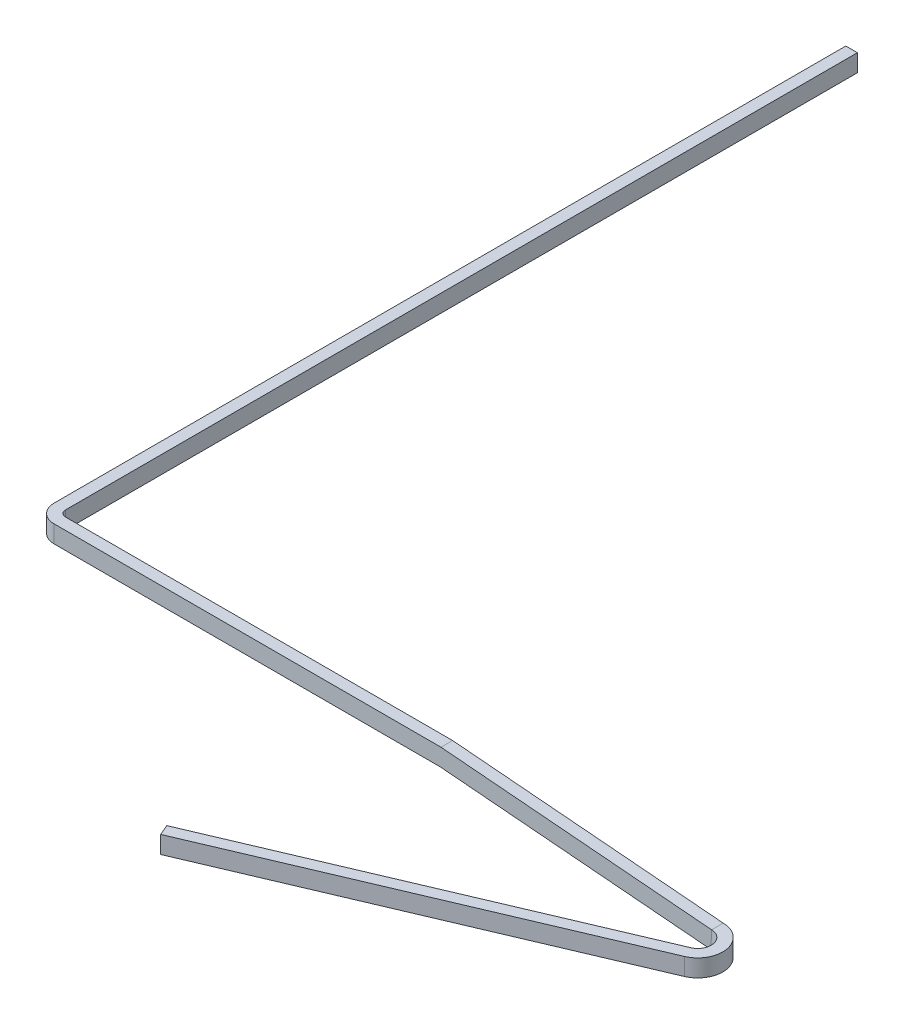
ISO-10303-21;
HEADER;
FILE_DESCRIPTION(('STEP AP214'),'2;1');
FILE_NAME('part.step','',(''),(''),'','','');
FILE_SCHEMA(('AUTOMOTIVE_DESIGN { 1 0 10303 214 1 1 1 1 }'));
ENDSEC;
DATA;
#1=APPLICATION_CONTEXT('core data for automotive mechanical design processes');
#2=APPLICATION_PROTOCOL_DEFINITION('international standard','automotive_design',2000,#1);
#3=PRODUCT_CONTEXT('',#1,'mechanical');
#4=PRODUCT('Part','Part','',(#3));
#5=PRODUCT_RELATED_PRODUCT_CATEGORY('part','',(#4));
#6=PRODUCT_DEFINITION_FORMATION('','',#4);
#7=PRODUCT_DEFINITION_CONTEXT('part definition',#1,'design');
#8=PRODUCT_DEFINITION('design','',#6,#7);
#9=PRODUCT_DEFINITION_SHAPE('','',#8);
#10=(LENGTH_UNIT() NAMED_UNIT(*) SI_UNIT(.MILLI.,.METRE.));
#11=(NAMED_UNIT(*) PLANE_ANGLE_UNIT() SI_UNIT($,.RADIAN.));
#12=(NAMED_UNIT(*) SI_UNIT($,.STERADIAN.) SOLID_ANGLE_UNIT());
#13=UNCERTAINTY_MEASURE_WITH_UNIT(LENGTH_MEASURE(1.E-05),#10,'distance_accuracy_value','');
#14=(GEOMETRIC_REPRESENTATION_CONTEXT(3) GLOBAL_UNCERTAINTY_ASSIGNED_CONTEXT((#13)) GLOBAL_UNIT_ASSIGNED_CONTEXT((#10,
#11,#12)) REPRESENTATION_CONTEXT('',''));
#15=CARTESIAN_POINT('',(0.,0.,0.));
#16=DIRECTION('',(0.,0.,1.));
#17=DIRECTION('',(1.,0.,0.));
#18=AXIS2_PLACEMENT_3D('',#15,#16,#17);
#19=CARTESIAN_POINT('',(0.31,-0.82124000002901,20.64));
#20=DIRECTION('',(0.,0.,-1.));
#21=DIRECTION('',(0.,1.,0.));
#22=AXIS2_PLACEMENT_3D('',#19,#20,#21);
#23=PLANE('',#22);
#24=DIRECTION('',(1.,0.,0.));
#25=VECTOR('',#24,1.);
#26=CARTESIAN_POINT('',(5.07526731903415,-0.225,20.64));
#27=LINE('',#26,#25);
#28=CARTESIAN_POINT('',(0.31,-0.225,20.64));
#29=VERTEX_POINT('',#28);
#30=CARTESIAN_POINT('',(10.3005346380683,-0.225,20.64));
#31=VERTEX_POINT('',#30);
#32=EDGE_CURVE('E192',#29,#31,#27,.T.);
#33=ORIENTED_EDGE('',*,*,#32,.F.);
#34=DIRECTION('',(0.,-1.,0.));
#35=VECTOR('',#34,1.);
#36=CARTESIAN_POINT('',(0.31,0.,20.64));
#37=LINE('',#36,#35);
#38=CARTESIAN_POINT('',(0.31,0.225,20.64));
#39=VERTEX_POINT('',#38);
#40=EDGE_CURVE('E152',#39,#29,#37,.T.);
#41=ORIENTED_EDGE('',*,*,#40,.F.);
#42=DIRECTION('',(-1.,0.,0.));
#43=VECTOR('',#42,1.);
#44=CARTESIAN_POINT('',(5.08473268096585,0.225,20.64));
#45=LINE('',#44,#43);
#46=CARTESIAN_POINT('',(10.3194653619317,0.225,20.64));
#47=VERTEX_POINT('',#46);
#48=EDGE_CURVE('E149',#47,#39,#45,.T.);
#49=ORIENTED_EDGE('',*,*,#48,.F.);
#50=DIRECTION('',(-0.996466773326447,0.0839879137518004,0.));
#51=VECTOR('',#50,1.);
#52=CARTESIAN_POINT('',(13.8194653619317,-0.07,20.64));
#53=LINE('',#52,#51);
#54=CARTESIAN_POINT('',(17.3194649116883,-0.365000000000001,20.6400389493132));
#55=VERTEX_POINT('',#54);
#56=EDGE_CURVE('E138',#55,#47,#53,.T.);
#57=ORIENTED_EDGE('',*,*,#56,.F.);
#58=CARTESIAN_POINT('',(17.3005346380122,-0.815000000000521,20.639997601188));
#59=CARTESIAN_POINT('',(17.3012298975785,-0.796249667150134,20.6399975922693));
#60=CARTESIAN_POINT('',(17.3019334087774,-0.777499635128396,20.6399976018067));
#61=CARTESIAN_POINT('',(17.3033612874137,-0.739999571047245,20.6399977112623));
#62=CARTESIAN_POINT('',(17.3040856557329,-0.72124953902144,20.6399978111843));
#63=CARTESIAN_POINT('',(17.3055595825119,-0.683749466995581,20.6399981548962));
#64=CARTESIAN_POINT('',(17.306309142305,-0.6649994270478,20.6399983986937));
#65=CARTESIAN_POINT('',(17.3078384491819,-0.627499360913254,20.6399988782718));
#66=CARTESIAN_POINT('',(17.308618198214,-0.608749334805732,20.6399991140517));
#67=CARTESIAN_POINT('',(17.3102102158603,-0.571249415216538,20.6400002472489));
#68=CARTESIAN_POINT('',(17.3110224866391,-0.552499521827045,20.6400011447102));
#69=CARTESIAN_POINT('',(17.312663946283,-0.514999615109501,20.6400073254552));
#70=CARTESIAN_POINT('',(17.3134931359251,-0.496249601815657,20.6400126089409));
#71=CARTESIAN_POINT('',(17.3151699392487,-0.458749601669613,20.6400267565518));
#72=CARTESIAN_POINT('',(17.3160175537115,-0.439999614852375,20.6400356208293));
#73=CARTESIAN_POINT('',(17.3177290759335,-0.40249964118995,20.6400570974933));
#74=CARTESIAN_POINT('',(17.318592984338,-0.383749654374282,20.6400697100286));
#75=CARTESIAN_POINT('',(17.3194639576097,-0.365,20.6400842800839));
#76=B_SPLINE_CURVE_WITH_KNOTS('',3,(#58,#59,#60,#61,#62,#63,#64,#65,#66,#67,#68,#69,#70,#71,#72,
#73,#74,#75),.UNSPECIFIED.,.F.,.F.,(4,2,2,2,2,2,2,2,4),(0.,0.0562896613957449,0.112581705992834,
0.168876734843459,0.225175402834835,0.281477824138597,0.337782837112942,0.394090242020051,
0.450399881124162),.UNSPECIFIED.);
#77=CARTESIAN_POINT('',(17.3005346380568,-0.815000000005767,20.6399995202376));
#78=VERTEX_POINT('',#77);
#79=EDGE_CURVE('E216',#55,#78,#76,.F.);
#80=ORIENTED_EDGE('',*,*,#79,.T.);
#81=DIRECTION('',(0.996466773326447,-0.0839879137518006,0.));
#82=VECTOR('',#81,1.);
#83=CARTESIAN_POINT('',(13.8005346380683,-0.52,20.64));
#84=LINE('',#83,#82);
#85=EDGE_CURVE('E171',#31,#78,#84,.T.);
#86=ORIENTED_EDGE('',*,*,#85,.F.);
#87=EDGE_LOOP('',(#33,#41,#49,#57,#80,#86));
#88=FACE_BOUND('',#87,.T.);
#89=ADVANCED_FACE('F15',(#88),#23,.T.);
#90=CARTESIAN_POINT('',(0.31,-0.27,20.48));
#91=DIRECTION('',(0.,1.,0.));
#92=DIRECTION('',(0.,0.,1.));
#93=AXIS2_PLACEMENT_3D('',#90,#91,#92);
#94=CYLINDRICAL_SURFACE('',#93,0.160000000000002);
#95=DIRECTION('',(0.,-1.,0.));
#96=VECTOR('',#95,1.);
#97=CARTESIAN_POINT('',(0.15,0.,20.48));
#98=LINE('',#97,#96);
#99=CARTESIAN_POINT('',(0.149999999999976,0.225,20.48));
#100=VERTEX_POINT('',#99);
#101=CARTESIAN_POINT('',(0.150000000000026,-0.225,20.48));
#102=VERTEX_POINT('',#101);
#103=EDGE_CURVE('E93',#100,#102,#98,.T.);
#104=ORIENTED_EDGE('',*,*,#103,.F.);
#105=CARTESIAN_POINT('',(0.31,0.225,20.48));
#106=DIRECTION('',(0.,1.,0.));
#107=DIRECTION('',(0.,0.,1.));
#108=AXIS2_PLACEMENT_3D('',#105,#106,#107);
#109=CIRCLE('',#108,0.160000000000002);
#110=EDGE_CURVE('E156',#39,#100,#109,.F.);
#111=ORIENTED_EDGE('',*,*,#110,.F.);
#112=ORIENTED_EDGE('',*,*,#40,.T.);
#113=CARTESIAN_POINT('',(0.31,-0.225,20.48));
#114=DIRECTION('',(0.,1.,0.));
#115=DIRECTION('',(0.,0.,1.));
#116=AXIS2_PLACEMENT_3D('',#113,#114,#115);
#117=CIRCLE('',#116,0.160000000000002);
#118=EDGE_CURVE('E19',#102,#29,#117,.T.);
#119=ORIENTED_EDGE('',*,*,#118,.F.);
#120=EDGE_LOOP('',(#104,#111,#112,#119));
#121=FACE_BOUND('',#120,.T.);
#122=ADVANCED_FACE('F367',(#121),#94,.F.);
#123=CARTESIAN_POINT('',(0.15,-0.225,0.));
#124=DIRECTION('',(1.,0.,0.));
#125=DIRECTION('',(0.,1.,0.));
#126=AXIS2_PLACEMENT_3D('',#123,#124,#125);
#127=PLANE('',#126);
#128=DIRECTION('',(0.,-1.,0.));
#129=VECTOR('',#128,1.);
#130=CARTESIAN_POINT('',(0.15,0.,0.));
#131=LINE('',#130,#129);
#132=CARTESIAN_POINT('',(0.149999999999969,0.225,0.));
#133=VERTEX_POINT('',#132);
#134=CARTESIAN_POINT('',(0.150000000000026,-0.225,0.));
#135=VERTEX_POINT('',#134);
#136=EDGE_CURVE('E105',#133,#135,#131,.T.);
#137=ORIENTED_EDGE('',*,*,#136,.F.);
#138=DIRECTION('',(0.,0.,-1.));
#139=VECTOR('',#138,1.);
#140=CARTESIAN_POINT('',(0.149999999999953,0.225,10.47));
#141=LINE('',#140,#139);
#142=EDGE_CURVE('E209',#100,#133,#141,.T.);
#143=ORIENTED_EDGE('',*,*,#142,.F.);
#144=ORIENTED_EDGE('',*,*,#103,.T.);
#145=DIRECTION('',(0.,0.,1.));
#146=VECTOR('',#145,1.);
#147=CARTESIAN_POINT('',(0.150000000000052,-0.225,10.47));
#148=LINE('',#147,#146);
#149=EDGE_CURVE('E183',#135,#102,#148,.T.);
#150=ORIENTED_EDGE('',*,*,#149,.F.);
#151=EDGE_LOOP('',(#137,#143,#144,#150));
#152=FACE_BOUND('',#151,.T.);
#153=ADVANCED_FACE('F369',(#152),#127,.T.);
#154=CARTESIAN_POINT('',(0.15,-0.225,0.));
#155=DIRECTION('',(0.,0.,-1.));
#156=DIRECTION('',(-1.,0.,0.));
#157=AXIS2_PLACEMENT_3D('',#154,#155,#156);
#158=PLANE('',#157);
#159=DIRECTION('',(0.,-1.,0.));
#160=VECTOR('',#159,1.);
#161=CARTESIAN_POINT('',(-0.15,0.,0.));
#162=LINE('',#161,#160);
#163=CARTESIAN_POINT('',(-0.15,0.225,0.));
#164=VERTEX_POINT('',#163);
#165=CARTESIAN_POINT('',(-0.15,-0.225,0.));
#166=VERTEX_POINT('',#165);
#167=EDGE_CURVE('E197',#164,#166,#162,.T.);
#168=ORIENTED_EDGE('',*,*,#167,.F.);
#169=DIRECTION('',(-1.,0.,0.));
#170=VECTOR('',#169,1.);
#171=CARTESIAN_POINT('',(5.08473268096585,0.225,0.));
#172=LINE('',#171,#170);
#173=EDGE_CURVE('E205',#133,#164,#172,.T.);
#174=ORIENTED_EDGE('',*,*,#173,.F.);
#175=ORIENTED_EDGE('',*,*,#136,.T.);
#176=DIRECTION('',(1.,0.,0.));
#177=VECTOR('',#176,1.);
#178=CARTESIAN_POINT('',(5.07526731903415,-0.225,0.));
#179=LINE('',#178,#177);
#180=EDGE_CURVE('E186',#166,#135,#179,.T.);
#181=ORIENTED_EDGE('',*,*,#180,.F.);
#182=EDGE_LOOP('',(#168,#174,#175,#181));
#183=FACE_BOUND('',#182,.T.);
#184=ADVANCED_FACE('F371',(#183),#158,.T.);
#185=CARTESIAN_POINT('',(-0.15,0.225,0.));
#186=DIRECTION('',(-1.,0.,0.));
#187=DIRECTION('',(0.,-1.,0.));
#188=AXIS2_PLACEMENT_3D('',#185,#186,#187);
#189=PLANE('',#188);
#190=DIRECTION('',(0.,0.,1.));
#191=VECTOR('',#190,1.);
#192=CARTESIAN_POINT('',(-0.15,0.225,10.47));
#193=LINE('',#192,#191);
#194=CARTESIAN_POINT('',(-0.15,0.225,20.48));
#195=VERTEX_POINT('',#194);
#196=EDGE_CURVE('E208',#164,#195,#193,.T.);
#197=ORIENTED_EDGE('',*,*,#196,.F.);
#198=ORIENTED_EDGE('',*,*,#167,.T.);
#199=DIRECTION('',(0.,0.,-1.));
#200=VECTOR('',#199,1.);
#201=CARTESIAN_POINT('',(-0.15,-0.225,10.47));
#202=LINE('',#201,#200);
#203=CARTESIAN_POINT('',(-0.15,-0.225,20.48));
#204=VERTEX_POINT('',#203);
#205=EDGE_CURVE('E189',#204,#166,#202,.T.);
#206=ORIENTED_EDGE('',*,*,#205,.F.);
#207=DIRECTION('',(0.,1.,0.));
#208=VECTOR('',#207,1.);
#209=CARTESIAN_POINT('',(-0.15,0.,20.48));
#210=LINE('',#209,#208);
#211=EDGE_CURVE('E200',#204,#195,#210,.T.);
#212=ORIENTED_EDGE('',*,*,#211,.T.);
#213=EDGE_LOOP('',(#197,#198,#206,#212));
#214=FACE_BOUND('',#213,.T.);
#215=ADVANCED_FACE('F404',(#214),#189,.T.);
#216=CARTESIAN_POINT('',(-0.15,-0.225,20.94));
#217=DIRECTION('',(0.,-1.,0.));
#218=DIRECTION('',(0.,0.,-1.));
#219=AXIS2_PLACEMENT_3D('',#216,#217,#218);
#220=PLANE('',#219);
#221=ORIENTED_EDGE('',*,*,#149,.T.);
#222=ORIENTED_EDGE('',*,*,#118,.T.);
#223=ORIENTED_EDGE('',*,*,#32,.T.);
#224=DIRECTION('',(0.,0.,-1.));
#225=VECTOR('',#224,1.);
#226=CARTESIAN_POINT('',(10.3005346380683,-0.225,20.79));
#227=LINE('',#226,#225);
#228=CARTESIAN_POINT('',(10.3005346380683,-0.225000000000001,20.94));
#229=VERTEX_POINT('',#228);
#230=EDGE_CURVE('E170',#229,#31,#227,.T.);
#231=ORIENTED_EDGE('',*,*,#230,.F.);
#232=DIRECTION('',(1.,0.,0.));
#233=VECTOR('',#232,1.);
#234=CARTESIAN_POINT('',(8.86576107705164,-0.225000000000003,20.94));
#235=LINE('',#234,#233);
#236=CARTESIAN_POINT('',(0.310000000000003,-0.225000000000002,20.94));
#237=VERTEX_POINT('',#236);
#238=EDGE_CURVE('E178',#237,#229,#235,.T.);
#239=ORIENTED_EDGE('',*,*,#238,.F.);
#240=CARTESIAN_POINT('',(0.310000000000006,-0.225,20.48));
#241=DIRECTION('',(0.,1.,0.));
#242=DIRECTION('',(0.,0.,1.));
#243=AXIS2_PLACEMENT_3D('',#240,#241,#242);
#244=CIRCLE('',#243,0.460000000000002);
#245=EDGE_CURVE('E339',#204,#237,#244,.T.);
#246=ORIENTED_EDGE('',*,*,#245,.F.);
#247=ORIENTED_EDGE('',*,*,#205,.T.);
#248=ORIENTED_EDGE('',*,*,#180,.T.);
#249=EDGE_LOOP('',(#221,#222,#223,#231,#239,#246,#247,#248));
#250=FACE_BOUND('',#249,.T.);
#251=ADVANCED_FACE('F379',(#250),#220,.T.);
#252=CARTESIAN_POINT('',(10.3005346380683,-0.225,20.64));
#253=DIRECTION('',(-0.0839879137518006,-0.996466773326447,0.));
#254=DIRECTION('',(0.996466773326447,-0.0839879137518006,0.));
#255=AXIS2_PLACEMENT_3D('',#252,#253,#254);
#256=PLANE('',#255);
#257=DIRECTION('',(0.996466773326447,-0.0839879137518015,0.));
#258=VECTOR('',#257,1.);
#259=CARTESIAN_POINT('',(10.3005346380683,-0.225000000000003,20.94));
#260=LINE('',#259,#258);
#261=CARTESIAN_POINT('',(17.3005346380558,-0.815,20.9399997480546));
#262=VERTEX_POINT('',#261);
#263=EDGE_CURVE('E181',#229,#262,#260,.T.);
#264=ORIENTED_EDGE('',*,*,#263,.F.);
#265=ORIENTED_EDGE('',*,*,#230,.T.);
#266=ORIENTED_EDGE('',*,*,#85,.T.);
#267=DIRECTION('',(0.,0.,1.));
#268=VECTOR('',#267,1.);
#269=CARTESIAN_POINT('',(17.3005346380683,-0.815,20.79));
#270=LINE('',#269,#268);
#271=EDGE_CURVE('E128',#78,#262,#270,.T.);
#272=ORIENTED_EDGE('',*,*,#271,.T.);
#273=EDGE_LOOP('',(#264,#265,#266,#272));
#274=FACE_BOUND('',#273,.T.);
#275=ADVANCED_FACE('F394',(#274),#256,.T.);
#276=CARTESIAN_POINT('',(17.3194653619317,-0.365,20.64));
#277=DIRECTION('',(0.0839879137518004,0.996466773326447,0.));
#278=DIRECTION('',(-0.996466773326447,0.0839879137518004,0.));
#279=AXIS2_PLACEMENT_3D('',#276,#277,#278);
#280=PLANE('',#279);
#281=ORIENTED_EDGE('',*,*,#56,.T.);
#282=DIRECTION('',(0.,0.,-1.));
#283=VECTOR('',#282,1.);
#284=CARTESIAN_POINT('',(10.3194653619317,0.225,10.47));
#285=LINE('',#284,#283);
#286=CARTESIAN_POINT('',(10.3194653619317,0.224999999999997,20.94));
#287=VERTEX_POINT('',#286);
#288=EDGE_CURVE('E143',#287,#47,#285,.T.);
#289=ORIENTED_EDGE('',*,*,#288,.F.);
#290=DIRECTION('',(-0.996466773326447,0.0839879137517995,0.));
#291=VECTOR('',#290,1.);
#292=CARTESIAN_POINT('',(17.3194653619317,-0.364999999999996,20.94));
#293=LINE('',#292,#291);
#294=CARTESIAN_POINT('',(17.3194651488147,-0.36500000014793,20.9400590063893));
#295=VERTEX_POINT('',#294);
#296=EDGE_CURVE('E351',#295,#287,#293,.T.);
#297=ORIENTED_EDGE('',*,*,#296,.F.);
#298=DIRECTION('',(0.,0.,1.));
#299=VECTOR('',#298,1.);
#300=CARTESIAN_POINT('',(17.3194653619317,-0.364999999999998,20.64));
#301=LINE('',#300,#299);
#302=EDGE_CURVE('E145',#295,#55,#301,.F.);
#303=ORIENTED_EDGE('',*,*,#302,.T.);
#304=EDGE_LOOP('',(#281,#289,#297,#303));
#305=FACE_BOUND('',#304,.T.);
#306=ADVANCED_FACE('F140',(#305),#280,.T.);
#307=CARTESIAN_POINT('',(-0.15,0.225,0.));
#308=DIRECTION('',(0.,1.,0.));
#309=DIRECTION('',(0.,0.,1.));
#310=AXIS2_PLACEMENT_3D('',#307,#308,#309);
#311=PLANE('',#310);
#312=ORIENTED_EDGE('',*,*,#196,.T.);
#313=CARTESIAN_POINT('',(0.310000000000006,0.225,20.48));
#314=DIRECTION('',(0.,1.,0.));
#315=DIRECTION('',(0.,0.,1.));
#316=AXIS2_PLACEMENT_3D('',#313,#314,#315);
#317=CIRCLE('',#316,0.460000000000002);
#318=CARTESIAN_POINT('',(0.310000000000003,0.225,20.94));
#319=VERTEX_POINT('',#318);
#320=EDGE_CURVE('E182',#319,#195,#317,.F.);
#321=ORIENTED_EDGE('',*,*,#320,.F.);
#322=DIRECTION('',(-1.,0.,0.));
#323=VECTOR('',#322,1.);
#324=CARTESIAN_POINT('',(8.86576107705164,0.225,20.94));
#325=LINE('',#324,#323);
#326=EDGE_CURVE('E161',#287,#319,#325,.T.);
#327=ORIENTED_EDGE('',*,*,#326,.F.);
#328=ORIENTED_EDGE('',*,*,#288,.T.);
#329=ORIENTED_EDGE('',*,*,#48,.T.);
#330=ORIENTED_EDGE('',*,*,#110,.T.);
#331=ORIENTED_EDGE('',*,*,#142,.T.);
#332=ORIENTED_EDGE('',*,*,#173,.T.);
#333=EDGE_LOOP('',(#312,#321,#327,#328,#329,#330,#331,#332));
#334=FACE_BOUND('',#333,.T.);
#335=ADVANCED_FACE('F159',(#334),#311,.T.);
#336=CARTESIAN_POINT('',(0.310000000000006,-0.27,20.48));
#337=DIRECTION('',(0.,1.,0.));
#338=DIRECTION('',(0.,0.,1.));
#339=AXIS2_PLACEMENT_3D('',#336,#337,#338);
#340=CYLINDRICAL_SURFACE('',#339,0.460000000000002);
#341=ORIENTED_EDGE('',*,*,#320,.T.);
#342=ORIENTED_EDGE('',*,*,#211,.F.);
#343=ORIENTED_EDGE('',*,*,#245,.T.);
#344=DIRECTION('',(0.,-1.,0.));
#345=VECTOR('',#344,1.);
#346=CARTESIAN_POINT('',(0.31,-0.29812,20.94));
#347=LINE('',#346,#345);
#348=EDGE_CURVE('E347',#319,#237,#347,.T.);
#349=ORIENTED_EDGE('',*,*,#348,.F.);
#350=EDGE_LOOP('',(#341,#342,#343,#349));
#351=FACE_BOUND('',#350,.T.);
#352=ADVANCED_FACE('F375',(#351),#340,.T.);
#353=CARTESIAN_POINT('',(0.31,0.225,20.94));
#354=DIRECTION('',(0.,0.,1.));
#355=DIRECTION('',(0.,-1.,0.));
#356=AXIS2_PLACEMENT_3D('',#353,#354,#355);
#357=PLANE('',#356);
#358=ORIENTED_EDGE('',*,*,#326,.T.);
#359=ORIENTED_EDGE('',*,*,#348,.T.);
#360=ORIENTED_EDGE('',*,*,#238,.T.);
#361=ORIENTED_EDGE('',*,*,#263,.T.);
#362=CARTESIAN_POINT('',(17.3194628287803,-0.365,20.940106068796));
#363=CARTESIAN_POINT('',(17.3187329355075,-0.382361061622873,20.9400886374364));
#364=CARTESIAN_POINT('',(17.3180065109305,-0.399722270562653,20.9400737393886));
#365=CARTESIAN_POINT('',(17.3165413197582,-0.434841488621655,20.9400481473676));
#366=CARTESIAN_POINT('',(17.3158026503292,-0.45259950187349,20.9400375572123));
#367=CARTESIAN_POINT('',(17.3143103017977,-0.488512308812431,20.9400202729684));
#368=CARTESIAN_POINT('',(17.3135566560335,-0.50666710392769,20.9400136712039));
#369=CARTESIAN_POINT('',(17.3120345566697,-0.543373554047353,20.940004327445));
#370=CARTESIAN_POINT('',(17.3112661394343,-0.561925210570869,20.9400016729631));
#371=CARTESIAN_POINT('',(17.3097060758089,-0.599425367801245,20.9399991768578));
#372=CARTESIAN_POINT('',(17.3089142842807,-0.618373862531827,20.9399993966639));
#373=CARTESIAN_POINT('',(17.3072938726852,-0.656667440495856,20.9399993418821));
#374=CARTESIAN_POINT('',(17.3064648284883,-0.676012505762628,20.9399990568277));
#375=CARTESIAN_POINT('',(17.3047886245425,-0.715099515215726,20.9399987376431));
#376=CARTESIAN_POINT('',(17.3039414421215,-0.734841458394906,20.9399987087815));
#377=CARTESIAN_POINT('',(17.3022379942455,-0.774722136976194,20.9399987213393));
#378=CARTESIAN_POINT('',(17.3013818880379,-0.79486087916739,20.9399987641816));
#379=CARTESIAN_POINT('',(17.300534638006,-0.815,20.939998740273));
#380=B_SPLINE_CURVE_WITH_KNOTS('',3,(#362,#363,#364,#365,#366,#367,#368,#369,#370,#371,#372,
#373,#374,#375,#376,#377,#378,#379),.UNSPECIFIED.,.F.,.F.,(4,2,2,2,2,2,2,2,4),(0.,
0.0521292179656815,0.105449335315358,0.159960631567767,0.215663324253443,0.272558408614429,
0.330646868572884,0.389927205435783,0.450397999359665),.UNSPECIFIED.);
#381=EDGE_CURVE('E323',#295,#262,#380,.T.);
#382=ORIENTED_EDGE('',*,*,#381,.F.);
#383=ORIENTED_EDGE('',*,*,#296,.T.);
#384=EDGE_LOOP('',(#358,#359,#360,#361,#382,#383));
#385=FACE_BOUND('',#384,.T.);
#386=ADVANCED_FACE('F298',(#385),#357,.T.);
#387=CARTESIAN_POINT('',(7.88116105055751,-0.365,20.6083388591933));
#388=DIRECTION('',(0.,1.,0.));
#389=DIRECTION('',(0.,0.,1.));
#390=AXIS2_PLACEMENT_3D('',#387,#388,#389);
#391=PLANE('',#390);
#392=ORIENTED_EDGE('',*,*,#302,.F.);
#393=CARTESIAN_POINT('',(17.4468982813718,-0.365,21.6121162221271));
#394=CARTESIAN_POINT('',(17.4832168122492,-0.365,21.5967166983423));
#395=CARTESIAN_POINT('',(17.5167935170041,-0.365,21.5749093442413));
#396=CARTESIAN_POINT('',(17.5750871990036,-0.365,21.5216299508138));
#397=CARTESIAN_POINT('',(17.5998090900435,-0.365,21.4901632897801));
#398=CARTESIAN_POINT('',(17.6370496372556,-0.365,21.4207206360232));
#399=CARTESIAN_POINT('',(17.6495782782568,-0.365,21.3827499993045));
#400=CARTESIAN_POINT('',(17.6616836151845,-0.365,21.3049572293665));
#401=CARTESIAN_POINT('',(17.6613108791084,-0.365,21.2651429356283));
#402=CARTESIAN_POINT('',(17.647050062198,-0.365,21.1877617934628));
#403=CARTESIAN_POINT('',(17.6330859668901,-0.365,21.1502088471539));
#404=CARTESIAN_POINT('',(17.5939146974426,-0.365,21.0819442419353));
#405=CARTESIAN_POINT('',(17.5687903681335,-0.365,21.0511846284162));
#406=CARTESIAN_POINT('',(17.5093404575264,-0.365,20.9995682778914));
#407=CARTESIAN_POINT('',(17.4749371787291,-0.365,20.9787994862511));
#408=CARTESIAN_POINT('',(17.4193152769054,-0.365,20.9568851020689));
#409=CARTESIAN_POINT('',(17.3997871846536,-0.365,20.9511074075389));
#410=CARTESIAN_POINT('',(17.3600247315652,-0.365,20.9429976366488));
#411=CARTESIAN_POINT('',(17.3397902615573,-0.365,20.9406660953291));
#412=CARTESIAN_POINT('',(17.3194640240084,-0.365,20.9401060973428));
#413=B_SPLINE_CURVE_WITH_KNOTS('',3,(#393,#394,#395,#396,#397,#398,#399,#400,#401,#402,#403,
#404,#405,#406,#407,#408,#409,#410,#411,#412),.UNSPECIFIED.,.F.,.F.,(4,2,2,2,2,2,2,2,2,4),(0.,
0.117848498601455,0.23563149792862,0.353317965560293,0.470543203933929,0.588427855554568,
0.705451679315637,0.823487579408455,0.884319496090172,0.945160856379792),.UNSPECIFIED.);
#414=CARTESIAN_POINT('',(17.4468982813718,-0.365,21.6121162221271));
#415=VERTEX_POINT('',#414);
#416=EDGE_CURVE('E317',#415,#295,#413,.T.);
#417=ORIENTED_EDGE('',*,*,#416,.F.);
#418=DIRECTION('',(0.920332063220277,0.,-0.391137946776719));
#419=VECTOR('',#418,1.);
#420=CARTESIAN_POINT('',(12.6941137946777,-0.365,23.632033206322));
#421=LINE('',#420,#419);
#422=CARTESIAN_POINT('',(7.94132930798349,-0.365,25.651950190517));
#423=VERTEX_POINT('',#422);
#424=EDGE_CURVE('E326',#423,#415,#421,.T.);
#425=ORIENTED_EDGE('',*,*,#424,.F.);
#426=DIRECTION('',(0.391137946776788,0.,0.920332063220248));
#427=VECTOR('',#426,1.);
#428=CARTESIAN_POINT('',(7.94132930798348,-0.365,25.6519501905169));
#429=LINE('',#428,#427);
#430=CARTESIAN_POINT('',(8.05867069201651,-0.365,25.928049809483));
#431=VERTEX_POINT('',#430);
#432=EDGE_CURVE('E336',#423,#431,#429,.T.);
#433=ORIENTED_EDGE('',*,*,#432,.T.);
#434=DIRECTION('',(-0.920332063220278,0.,0.391137946776717));
#435=VECTOR('',#434,1.);
#436=CARTESIAN_POINT('',(12.8114551787107,-0.365,23.9081328252881));
#437=LINE('',#436,#435);
#438=CARTESIAN_POINT('',(17.5642396654048,-0.365,21.8882158410932));
#439=VERTEX_POINT('',#438);
#440=EDGE_CURVE('E333',#439,#431,#437,.T.);
#441=ORIENTED_EDGE('',*,*,#440,.F.);
#442=CARTESIAN_POINT('',(17.3194641562925,-0.365,20.6400842833945));
#443=CARTESIAN_POINT('',(17.3578117410267,-0.365,20.6406370135452));
#444=CARTESIAN_POINT('',(17.396006832357,-0.365,20.6445873231824));
#445=CARTESIAN_POINT('',(17.4711016163464,-0.365,20.6591148647449));
#446=CARTESIAN_POINT('',(17.5080017265663,-0.365,20.669689939421));
#447=CARTESIAN_POINT('',(17.6122521693177,-0.365,20.7099229199255));
#448=CARTESIAN_POINT('',(17.6765915278004,-0.365,20.7481880471067));
#449=CARTESIAN_POINT('',(17.7601042367253,-0.365,20.8196819797044));
#450=CARTESIAN_POINT('',(17.7857449125703,-0.365,20.8458094054485));
#451=CARTESIAN_POINT('',(17.8323256825544,-0.365,20.9019522318635));
#452=CARTESIAN_POINT('',(17.8532715890921,-0.365,20.9319627515773));
#453=CARTESIAN_POINT('',(17.8900516236185,-0.365,20.9951737895815));
#454=CARTESIAN_POINT('',(17.9058585397232,-0.365,21.0283901190723));
#455=CARTESIAN_POINT('',(17.9316606748038,-0.365,21.0969657070031));
#456=CARTESIAN_POINT('',(17.9416606402444,-0.365,21.1323231891342));
#457=CARTESIAN_POINT('',(17.9621023824869,-0.365,21.2397974401524));
#458=CARTESIAN_POINT('',(17.9632886814549,-0.365,21.3138371230517));
#459=CARTESIAN_POINT('',(17.9416471960527,-0.365,21.458562894643));
#460=CARTESIAN_POINT('',(17.9187454578841,-0.365,21.5292379551985));
#461=CARTESIAN_POINT('',(17.8675740043967,-0.365,21.6260922309584));
#462=CARTESIAN_POINT('',(17.847678418255,-0.365,21.6568832104499));
#463=CARTESIAN_POINT('',(17.8030418215426,-0.365,21.7147132959485));
#464=CARTESIAN_POINT('',(17.7783036623459,-0.365,21.74175459389));
#465=CARTESIAN_POINT('',(17.7240593184336,-0.365,21.7920048437738));
#466=CARTESIAN_POINT('',(17.6944514846335,-0.365,21.8151041330875));
#467=CARTESIAN_POINT('',(17.631755140608,-0.365,21.8558921496879));
#468=CARTESIAN_POINT('',(17.5986692329275,-0.365,21.8735848843576));
#469=CARTESIAN_POINT('',(17.5642396654048,-0.365,21.8882158410932));
#470=B_SPLINE_CURVE_WITH_KNOTS('',3,(#442,#443,#444,#445,#446,#447,#448,#449,#450,#451,#452,
#453,#454,#455,#456,#457,#458,#459,#460,#461,#462,#463,#464,#465,#466,#467,#468,#469),
.UNSPECIFIED.,.F.,.F.,(4,2,2,2,2,2,2,2,2,2,2,2,2,4),(0.,0.114701454961517,0.229365578627013,
0.448883114686277,0.558290689464259,0.667562053744955,0.777402946522351,0.887153931104934,
1.10494376682045,1.32340420635785,1.43290744421955,1.54234639795385,1.65445681085308,
1.76648392389306),.UNSPECIFIED.);
#471=EDGE_CURVE('E315',#55,#439,#470,.T.);
#472=ORIENTED_EDGE('',*,*,#471,.F.);
#473=EDGE_LOOP('',(#392,#417,#425,#433,#441,#472));
#474=FACE_BOUND('',#473,.T.);
#475=ADVANCED_FACE('F294',(#474),#391,.T.);
#476=CARTESIAN_POINT('',(8.0586706920165,-0.815,25.928049809483));
#477=DIRECTION('',(0.391137946776717,0.,0.920332063220278));
#478=DIRECTION('',(0.920332063220278,0.,-0.391137946776717));
#479=AXIS2_PLACEMENT_3D('',#476,#477,#478);
#480=PLANE('',#479);
#481=DIRECTION('',(-0.920332063220279,0.,0.391137946776715));
#482=VECTOR('',#481,1.);
#483=CARTESIAN_POINT('',(17.5642396654048,-0.815,21.8882158410932));
#484=LINE('',#483,#482);
#485=CARTESIAN_POINT('',(17.5642396654048,-0.815,21.8882158410932));
#486=VERTEX_POINT('',#485);
#487=CARTESIAN_POINT('',(8.05867069201649,-0.815,25.928049809483));
#488=VERTEX_POINT('',#487);
#489=EDGE_CURVE('E390',#486,#488,#484,.T.);
#490=ORIENTED_EDGE('',*,*,#489,.F.);
#491=DIRECTION('',(0.,-1.,0.));
#492=VECTOR('',#491,1.);
#493=CARTESIAN_POINT('',(17.5642396654048,-0.59,21.8882158410932));
#494=LINE('',#493,#492);
#495=EDGE_CURVE('E237',#439,#486,#494,.T.);
#496=ORIENTED_EDGE('',*,*,#495,.F.);
#497=ORIENTED_EDGE('',*,*,#440,.T.);
#498=DIRECTION('',(0.,-1.,0.));
#499=VECTOR('',#498,1.);
#500=CARTESIAN_POINT('',(8.0586706920165,-0.59,25.928049809483));
#501=LINE('',#500,#499);
#502=EDGE_CURVE('E330',#431,#488,#501,.T.);
#503=ORIENTED_EDGE('',*,*,#502,.T.);
#504=EDGE_LOOP('',(#490,#496,#497,#503));
#505=FACE_BOUND('',#504,.T.);
#506=ADVANCED_FACE('F290',(#505),#480,.T.);
#507=CARTESIAN_POINT('',(17.4468982813718,-0.815,21.6121162221271));
#508=DIRECTION('',(-0.39113794677672,0.,-0.920332063220277));
#509=DIRECTION('',(-0.920332063220277,0.,0.39113794677672));
#510=AXIS2_PLACEMENT_3D('',#507,#508,#509);
#511=PLANE('',#510);
#512=ORIENTED_EDGE('',*,*,#424,.T.);
#513=DIRECTION('',(0.,1.,0.));
#514=VECTOR('',#513,1.);
#515=CARTESIAN_POINT('',(17.4468982813718,-0.59,21.6121162221271));
#516=LINE('',#515,#514);
#517=CARTESIAN_POINT('',(17.4468982813718,-0.815,21.6121162221271));
#518=VERTEX_POINT('',#517);
#519=EDGE_CURVE('E319',#518,#415,#516,.T.);
#520=ORIENTED_EDGE('',*,*,#519,.F.);
#521=DIRECTION('',(0.920332063220277,0.,-0.391137946776719));
#522=VECTOR('',#521,1.);
#523=CARTESIAN_POINT('',(7.94132930798348,-0.815,25.651950190517));
#524=LINE('',#523,#522);
#525=CARTESIAN_POINT('',(7.94132930798348,-0.815,25.651950190517));
#526=VERTEX_POINT('',#525);
#527=EDGE_CURVE('E386',#526,#518,#524,.T.);
#528=ORIENTED_EDGE('',*,*,#527,.F.);
#529=DIRECTION('',(0.,1.,0.));
#530=VECTOR('',#529,1.);
#531=CARTESIAN_POINT('',(7.94132930798349,-0.59,25.651950190517));
#532=LINE('',#531,#530);
#533=EDGE_CURVE('E33',#526,#423,#532,.T.);
#534=ORIENTED_EDGE('',*,*,#533,.T.);
#535=EDGE_LOOP('',(#512,#520,#528,#534));
#536=FACE_BOUND('',#535,.T.);
#537=ADVANCED_FACE('F286',(#536),#511,.T.);
#538=CARTESIAN_POINT('',(17.291899297884,-0.365,20.9399995397575));
#539=CARTESIAN_POINT('',(17.2982919136801,-0.365,20.9399988554657));
#540=CARTESIAN_POINT('',(17.3048156200277,-0.365,20.9399978653227));
#541=CARTESIAN_POINT('',(17.3221487614917,-0.365,20.9400050022732));
#542=CARTESIAN_POINT('',(17.330001593979,-0.365,20.9404291023397));
#543=CARTESIAN_POINT('',(17.349915868963,-0.365,20.9421399708764));
#544=CARTESIAN_POINT('',(17.3598334632571,-0.365,20.9434218193108));
#545=CARTESIAN_POINT('',(17.3893659714026,-0.365,20.9485321680292));
#546=CARTESIAN_POINT('',(17.4087606883959,-0.365,20.9536290289917));
#547=CARTESIAN_POINT('',(17.465210450649,-0.365,20.9737625398497));
#548=CARTESIAN_POINT('',(17.5004741867122,-0.365,20.9936625385647));
#549=CARTESIAN_POINT('',(17.593302370079,-0.365,21.0694892431176));
#550=CARTESIAN_POINT('',(17.6370098672595,-0.365,21.14184536003));
#551=CARTESIAN_POINT('',(17.6689065675115,-0.365,21.2984454974237));
#552=CARTESIAN_POINT('',(17.656982448521,-0.365,21.3821326817593));
#553=CARTESIAN_POINT('',(17.5826169077395,-0.365,21.5235921065536));
#554=CARTESIAN_POINT('',(17.5205491717276,-0.365,21.5808148482173));
#555=CARTESIAN_POINT('',(17.4468982813718,-0.365,21.6121162221271));
#556=CARTESIAN_POINT('',(17.291899297884,-0.815,20.9399995397575));
#557=CARTESIAN_POINT('',(17.2982919136801,-0.815,20.9399988554657));
#558=CARTESIAN_POINT('',(17.3048156200277,-0.815,20.9399978653227));
#559=CARTESIAN_POINT('',(17.3221487614917,-0.815,20.9400050022732));
#560=CARTESIAN_POINT('',(17.330001593979,-0.815,20.9404291023397));
#561=CARTESIAN_POINT('',(17.349915868963,-0.815,20.9421399708764));
#562=CARTESIAN_POINT('',(17.3598334632571,-0.815,20.9434218193108));
#563=CARTESIAN_POINT('',(17.3893659714026,-0.815,20.9485321680291));
#564=CARTESIAN_POINT('',(17.4087606883959,-0.815,20.9536290289917));
#565=CARTESIAN_POINT('',(17.465210450649,-0.815,20.9737625398497));
#566=CARTESIAN_POINT('',(17.5004741867122,-0.815,20.9936625385647));
#567=CARTESIAN_POINT('',(17.593302370079,-0.815,21.0694892431176));
#568=CARTESIAN_POINT('',(17.6370098672595,-0.815,21.14184536003));
#569=CARTESIAN_POINT('',(17.6689065675115,-0.815,21.2984454974237));
#570=CARTESIAN_POINT('',(17.656982448521,-0.815,21.3821326817593));
#571=CARTESIAN_POINT('',(17.5826169077395,-0.815,21.5235921065536));
#572=CARTESIAN_POINT('',(17.5205491717276,-0.815,21.5808148482173));
#573=CARTESIAN_POINT('',(17.4468982813718,-0.815,21.6121162221271));
#574=B_SPLINE_SURFACE_WITH_KNOTS('',1,3,((#538,#539,#540,#541,#542,#543,#544,#545,#546,#547,
#548,#549,#550,#551,#552,#553,#554,#555),(#556,#557,#558,#559,#560,#561,#562,#563,#564,#565,
#566,#567,#568,#569,#570,#571,#572,#573)),.UNSPECIFIED.,.F.,.F.,.F.,(2,2),(4,2,2,2,2,2,2,2,4),
(0.,1.),(-0.00156160068111,0.,0.00365936029408,0.00731872058815,0.0146374411763,
0.02927488235261,0.05854976470521,0.08782464705782,0.11709952941042),.UNSPECIFIED.);
#575=DIRECTION('',(-1.,0.,0.));
#576=VECTOR('',#575,1.);
#577=CARTESIAN_POINT('',(12.9513745961773,-0.815,20.94));
#578=LINE('',#577,#576);
#579=CARTESIAN_POINT('',(17.31,-0.815,20.94));
#580=VERTEX_POINT('',#579);
#581=EDGE_CURVE('E381',#580,#262,#578,.T.);
#582=CARTESIAN_POINT('',(17.4468982813718,-0.815,21.6121162221271));
#583=CARTESIAN_POINT('',(17.4832168228054,-0.815,21.5967167026277));
#584=CARTESIAN_POINT('',(17.5167935222807,-0.815,21.5749093463834));
#585=CARTESIAN_POINT('',(17.5750871937299,-0.815,21.5216299486728));
#586=CARTESIAN_POINT('',(17.599809079499,-0.815,21.4901632854995));
#587=CARTESIAN_POINT('',(17.6370496477914,-0.815,21.4207206403003));
#588=CARTESIAN_POINT('',(17.6495783151176,-0.815,21.3827500142687));
#589=CARTESIAN_POINT('',(17.6616835784681,-0.815,21.3049572144611));
#590=CARTESIAN_POINT('',(17.6613107429841,-0.815,21.2651428803669));
#591=CARTESIAN_POINT('',(17.647050199088,-0.815,21.1877618490349));
#592=CARTESIAN_POINT('',(17.6330864788598,-0.815,21.1502090549941));
#593=CARTESIAN_POINT('',(17.5939141892114,-0.815,21.0819440356128));
#594=CARTESIAN_POINT('',(17.5687884775294,-0.815,21.0511838609029));
#595=CARTESIAN_POINT('',(17.5093423644814,-0.815,20.9995690520425));
#596=CARTESIAN_POINT('',(17.4749443224732,-0.815,20.9788023863393));
#597=CARTESIAN_POINT('',(17.4178545314175,-0.815,20.9563095378121));
#598=CARTESIAN_POINT('',(17.3967640847152,-0.815,20.950222690725));
#599=CARTESIAN_POINT('',(17.3537994275228,-0.815,20.9420615933635));
#600=CARTESIAN_POINT('',(17.3319244702859,-0.815,20.93999127539));
#601=CARTESIAN_POINT('',(17.3099999999991,-0.815,20.94));
#602=B_SPLINE_CURVE_WITH_KNOTS('',3,(#582,#583,#584,#585,#586,#587,#588,#589,#590,#591,#592,
#593,#594,#595,#596,#597,#598,#599,#600,#601),.UNSPECIFIED.,.F.,.F.,(4,2,2,2,2,2,2,2,2,4),(0.,
0.117848498601456,0.235631497928621,0.353317965560273,0.470543203933945,0.588427855554544,
0.705451679315603,0.823487579408405,0.889004181515864,0.954584894010068),.UNSPECIFIED.);
#603=EDGE_CURVE('E277',#518,#580,#602,.T.);
#604=ORIENTED_EDGE('',*,*,#519,.T.);
#605=ORIENTED_EDGE('',*,*,#416,.T.);
#606=ORIENTED_EDGE('',*,*,#381,.T.);
#607=ORIENTED_EDGE('',*,*,#581,.F.);
#608=ORIENTED_EDGE('',*,*,#603,.F.);
#609=EDGE_LOOP('',(#604,#605,#606,#607,#608));
#610=FACE_BOUND('',#609,.T.);
#611=ADVANCED_FACE('F253',(#610),#574,.T.);
#612=CARTESIAN_POINT('',(17.292550841759,-0.815,20.639998911291));
#613=CARTESIAN_POINT('',(17.2979980432432,-0.815,20.6399976743159));
#614=CARTESIAN_POINT('',(17.3034075366134,-0.815,20.639996273931));
#615=CARTESIAN_POINT('',(17.326436507925,-0.815,20.640009289936));
#616=CARTESIAN_POINT('',(17.3471458173897,-0.815,20.6407969043451));
#617=CARTESIAN_POINT('',(17.3841294709313,-0.815,20.6439742316277));
#618=CARTESIAN_POINT('',(17.4025478603346,-0.815,20.6463548072916));
#619=CARTESIAN_POINT('',(17.4573939468906,-0.815,20.6558454549112));
#620=CARTESIAN_POINT('',(17.4934127070211,-0.815,20.6653110538417));
#621=CARTESIAN_POINT('',(17.5982479797767,-0.815,20.702701859721));
#622=CARTESIAN_POINT('',(17.6637377753225,-0.815,20.7396590001917));
#623=CARTESIAN_POINT('',(17.8361329730039,-0.815,20.8804800229327));
#624=CARTESIAN_POINT('',(17.9173040391963,-0.815,21.0148556686272));
#625=CARTESIAN_POINT('',(17.9765407682356,-0.815,21.3056844952153));
#626=CARTESIAN_POINT('',(17.9543959758242,-0.815,21.4611035518387));
#627=CARTESIAN_POINT('',(17.8162885429453,-0.815,21.723813912171));
#628=CARTESIAN_POINT('',(17.701019890351,-0.815,21.830084718118));
#629=CARTESIAN_POINT('',(17.5642396654048,-0.815,21.8882158410932));
#630=CARTESIAN_POINT('',(17.292550841759,-0.365,20.639998911291));
#631=CARTESIAN_POINT('',(17.2979980432432,-0.365,20.6399976743159));
#632=CARTESIAN_POINT('',(17.3034075366134,-0.365,20.639996273931));
#633=CARTESIAN_POINT('',(17.326436507925,-0.365,20.640009289936));
#634=CARTESIAN_POINT('',(17.3471458173897,-0.365,20.6407969043451));
#635=CARTESIAN_POINT('',(17.3841294709313,-0.365,20.6439742316277));
#636=CARTESIAN_POINT('',(17.4025478603346,-0.365,20.6463548072916));
#637=CARTESIAN_POINT('',(17.4573939468906,-0.365,20.6558454549112));
#638=CARTESIAN_POINT('',(17.4934127070211,-0.365,20.6653110538417));
#639=CARTESIAN_POINT('',(17.5982479797767,-0.365,20.702701859721));
#640=CARTESIAN_POINT('',(17.6637377753225,-0.365,20.7396590001917));
#641=CARTESIAN_POINT('',(17.8361329730039,-0.365,20.8804800229327));
#642=CARTESIAN_POINT('',(17.9173040391963,-0.365,21.0148556686272));
#643=CARTESIAN_POINT('',(17.9765407682356,-0.365,21.3056844952153));
#644=CARTESIAN_POINT('',(17.9543959758242,-0.365,21.4611035518387));
#645=CARTESIAN_POINT('',(17.8162885429453,-0.365,21.723813912171));
#646=CARTESIAN_POINT('',(17.701019890351,-0.365,21.830084718118));
#647=CARTESIAN_POINT('',(17.5642396654048,-0.365,21.8882158410932));
#648=B_SPLINE_SURFACE_WITH_KNOTS('',1,3,((#612,#613,#614,#615,#616,#617,#618,#619,#620,#621,
#622,#623,#624,#625,#626,#627,#628,#629),(#630,#631,#632,#633,#634,#635,#636,#637,#638,#639,
#640,#641,#642,#643,#644,#645,#646,#647)),.UNSPECIFIED.,.F.,.F.,.F.,(2,2),(4,2,2,2,2,2,2,2,4),
(0.,1.),(-0.00146772044689,0.,0.00365936029408,0.00731872058815,0.0146374411763,
0.02927488235261,0.05854976470521,0.08782464705782,0.11709952941042),.UNSPECIFIED.);
#649=CARTESIAN_POINT('',(17.31,-0.815,20.64));
#650=CARTESIAN_POINT('',(17.3483606594569,-0.815,20.6400043187598));
#651=CARTESIAN_POINT('',(17.3866209385163,-0.815,20.6434038848482));
#652=CARTESIAN_POINT('',(17.4619415597411,-0.815,20.6568465049287));
#653=CARTESIAN_POINT('',(17.4990023087749,-0.815,20.6668872809852));
#654=CARTESIAN_POINT('',(17.6035320282845,-0.815,20.7055004010782));
#655=CARTESIAN_POINT('',(17.6681440251927,-0.815,20.742620385323));
#656=CARTESIAN_POINT('',(17.7525656869372,-0.815,20.8125639201107));
#657=CARTESIAN_POINT('',(17.778638389113,-0.815,20.8382803707188));
#658=CARTESIAN_POINT('',(17.8261720771771,-0.815,20.8937547333406));
#659=CARTESIAN_POINT('',(17.8476291528473,-0.815,20.9235160374768));
#660=CARTESIAN_POINT('',(17.8853439325006,-0.815,20.9861354727812));
#661=CARTESIAN_POINT('',(17.9016047914567,-0.815,21.0189917090554));
#662=CARTESIAN_POINT('',(17.9284359321941,-0.815,21.0869629085812));
#663=CARTESIAN_POINT('',(17.9390028885501,-0.815,21.1220791783945));
#664=CARTESIAN_POINT('',(17.9612540661672,-0.815,21.2293255295456));
#665=CARTESIAN_POINT('',(17.9636128932806,-0.815,21.3035587484411));
#666=CARTESIAN_POINT('',(17.944191689323,-0.815,21.4485985844082));
#667=CARTESIAN_POINT('',(17.9224709915609,-0.814999999999999,21.5194131773754));
#668=CARTESIAN_POINT('',(17.87297413281,-0.815,21.6169868626308));
#669=CARTESIAN_POINT('',(17.8535562915535,-0.815,21.6481653519032));
#670=CARTESIAN_POINT('',(17.8097359898799,-0.815,21.7068684213285));
#671=CARTESIAN_POINT('',(17.7853277505721,-0.815,21.7343887037465));
#672=CARTESIAN_POINT('',(17.7305486135104,-0.815,21.7866956558073));
#673=CARTESIAN_POINT('',(17.6998905989944,-0.815,21.8111822524828));
#674=CARTESIAN_POINT('',(17.6347234185566,-0.815,21.8542980704111));
#675=CARTESIAN_POINT('',(17.6002156647724,-0.815,21.8729294299361));
#676=CARTESIAN_POINT('',(17.5642396654048,-0.815,21.8882158410932));
#677=B_SPLINE_CURVE_WITH_KNOTS('',3,(#649,#650,#651,#652,#653,#654,#655,#656,#657,#658,#659,
#660,#661,#662,#663,#664,#665,#666,#667,#668,#669,#670,#671,#672,#673,#674,#675,#676),
.UNSPECIFIED.,.F.,.F.,(4,2,2,2,2,2,2,2,2,2,2,2,2,4),(0.,0.114735445989208,0.229431558106392,
0.44799871103032,0.557446763097905,0.666987174205606,0.776460949023232,0.885998590996991,
1.10439143493569,1.32224734030522,1.43195857758357,1.54179758766737,1.65888211010923,
1.77592382467115),.UNSPECIFIED.);
#678=CARTESIAN_POINT('',(17.31,-0.815,20.64));
#679=VERTEX_POINT('',#678);
#680=EDGE_CURVE('E25',#679,#486,#677,.T.);
#681=DIRECTION('',(1.,0.,0.));
#682=VECTOR('',#681,1.);
#683=CARTESIAN_POINT('',(12.9513745961773,-0.815,20.64));
#684=LINE('',#683,#682);
#685=EDGE_CURVE('E272',#78,#679,#684,.T.);
#686=ORIENTED_EDGE('',*,*,#680,.F.);
#687=ORIENTED_EDGE('',*,*,#685,.F.);
#688=ORIENTED_EDGE('',*,*,#79,.F.);
#689=ORIENTED_EDGE('',*,*,#471,.T.);
#690=ORIENTED_EDGE('',*,*,#495,.T.);
#691=EDGE_LOOP('',(#686,#687,#688,#689,#690));
#692=FACE_BOUND('',#691,.T.);
#693=ADVANCED_FACE('F241',(#692),#648,.T.);
#694=CARTESIAN_POINT('',(7.88120876452516,-0.815,25.9597781083399));
#695=DIRECTION('',(0.,-1.,0.));
#696=DIRECTION('',(0.,0.,-1.));
#697=AXIS2_PLACEMENT_3D('',#694,#695,#696);
#698=PLANE('',#697);
#699=ORIENTED_EDGE('',*,*,#685,.T.);
#700=ORIENTED_EDGE('',*,*,#680,.T.);
#701=ORIENTED_EDGE('',*,*,#489,.T.);
#702=DIRECTION('',(0.391137946776721,0.,0.920332063220276));
#703=VECTOR('',#702,1.);
#704=CARTESIAN_POINT('',(7.99999999999999,-0.815,25.79));
#705=LINE('',#704,#703);
#706=EDGE_CURVE('E10',#526,#488,#705,.T.);
#707=ORIENTED_EDGE('',*,*,#706,.F.);
#708=ORIENTED_EDGE('',*,*,#527,.T.);
#709=ORIENTED_EDGE('',*,*,#603,.T.);
#710=ORIENTED_EDGE('',*,*,#581,.T.);
#711=ORIENTED_EDGE('',*,*,#271,.F.);
#712=EDGE_LOOP('',(#699,#700,#701,#707,#708,#709,#710,#711));
#713=FACE_BOUND('',#712,.T.);
#714=ADVANCED_FACE('F252',(#713),#698,.T.);
#715=CARTESIAN_POINT('',(7.94132930798348,-0.815,25.651950190517));
#716=DIRECTION('',(-0.920332063220277,0.,0.391137946776721));
#717=DIRECTION('',(0.391137946776721,0.,0.920332063220276));
#718=AXIS2_PLACEMENT_3D('',#715,#716,#717);
#719=PLANE('',#718);
#720=ORIENTED_EDGE('',*,*,#533,.F.);
#721=ORIENTED_EDGE('',*,*,#706,.T.);
#722=ORIENTED_EDGE('',*,*,#502,.F.);
#723=ORIENTED_EDGE('',*,*,#432,.F.);
#724=EDGE_LOOP('',(#720,#721,#722,#723));
#725=FACE_BOUND('',#724,.T.);
#726=ADVANCED_FACE('F17',(#725),#719,.T.);
#727=CLOSED_SHELL('',(#89,#122,#153,#184,#215,#251,#275,#306,#335,#352,#386,#475,#506,#537,#611,
#693,#714,#726));
#728=MANIFOLD_SOLID_BREP('B1',#727);
#729=ADVANCED_BREP_SHAPE_REPRESENTATION('',(#18,#728),#14);
#730=SHAPE_DEFINITION_REPRESENTATION(#9,#729);
ENDSEC;
END-ISO-10303-21;
